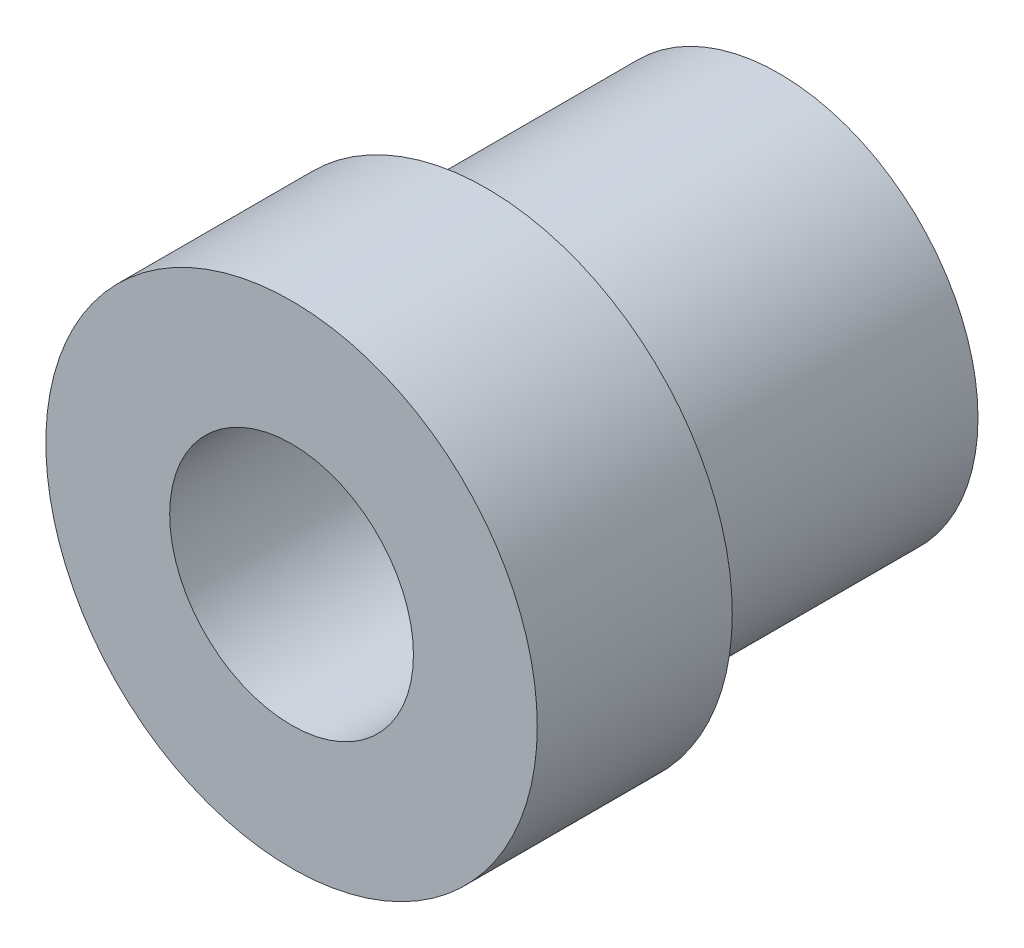
ISO-10303-21;
HEADER;
FILE_DESCRIPTION(('STEP AP214'),'2;1');
FILE_NAME('part.step','',(''),(''),'','','');
FILE_SCHEMA(('AUTOMOTIVE_DESIGN { 1 0 10303 214 1 1 1 1 }'));
ENDSEC;
DATA;
#1=APPLICATION_CONTEXT('core data for automotive mechanical design processes');
#2=APPLICATION_PROTOCOL_DEFINITION('international standard','automotive_design',2000,#1);
#3=PRODUCT_CONTEXT('',#1,'mechanical');
#4=PRODUCT('Part','Part','',(#3));
#5=PRODUCT_RELATED_PRODUCT_CATEGORY('part','',(#4));
#6=PRODUCT_DEFINITION_FORMATION('','',#4);
#7=PRODUCT_DEFINITION_CONTEXT('part definition',#1,'design');
#8=PRODUCT_DEFINITION('design','',#6,#7);
#9=PRODUCT_DEFINITION_SHAPE('','',#8);
#10=(LENGTH_UNIT() NAMED_UNIT(*) SI_UNIT(.MILLI.,.METRE.));
#11=(NAMED_UNIT(*) PLANE_ANGLE_UNIT() SI_UNIT($,.RADIAN.));
#12=(NAMED_UNIT(*) SI_UNIT($,.STERADIAN.) SOLID_ANGLE_UNIT());
#13=UNCERTAINTY_MEASURE_WITH_UNIT(LENGTH_MEASURE(1.E-05),#10,'distance_accuracy_value','');
#14=(GEOMETRIC_REPRESENTATION_CONTEXT(3) GLOBAL_UNCERTAINTY_ASSIGNED_CONTEXT((#13)) GLOBAL_UNIT_ASSIGNED_CONTEXT((#10,
#11,#12)) REPRESENTATION_CONTEXT('',''));
#15=CARTESIAN_POINT('',(0.,0.,0.));
#16=DIRECTION('',(0.,0.,1.));
#17=DIRECTION('',(1.,0.,0.));
#18=AXIS2_PLACEMENT_3D('',#15,#16,#17);
#19=CARTESIAN_POINT('',(0.,0.,6.35));
#20=DIRECTION('',(0.,0.,-1.));
#21=DIRECTION('',(-1.,0.,0.));
#22=AXIS2_PLACEMENT_3D('',#19,#20,#21);
#23=CYLINDRICAL_SURFACE('',#22,8.001);
#24=CARTESIAN_POINT('',(0.,0.,6.35));
#25=DIRECTION('',(0.,0.,1.));
#26=DIRECTION('',(1.,0.,0.));
#27=AXIS2_PLACEMENT_3D('',#24,#25,#26);
#28=CIRCLE('',#27,8.001);
#29=CARTESIAN_POINT('',(8.001,0.,6.35));
#30=VERTEX_POINT('',#29);
#31=EDGE_CURVE('E53',#30,#30,#28,.T.);
#32=ORIENTED_EDGE('',*,*,#31,.F.);
#33=EDGE_LOOP('',(#32));
#34=FACE_BOUND('',#33,.T.);
#35=CARTESIAN_POINT('',(0.,0.,0.));
#36=DIRECTION('',(0.,0.,1.));
#37=DIRECTION('',(1.,0.,0.));
#38=AXIS2_PLACEMENT_3D('',#35,#36,#37);
#39=CIRCLE('',#38,8.001);
#40=CARTESIAN_POINT('',(8.001,0.,0.));
#41=VERTEX_POINT('',#40);
#42=EDGE_CURVE('E48',#41,#41,#39,.T.);
#43=ORIENTED_EDGE('',*,*,#42,.T.);
#44=EDGE_LOOP('',(#43));
#45=FACE_BOUND('',#44,.T.);
#46=ADVANCED_FACE('F45',(#34,#45),#23,.T.);
#47=CARTESIAN_POINT('',(0.,0.,6.35));
#48=DIRECTION('',(0.,0.,-1.));
#49=DIRECTION('',(-1.,0.,0.));
#50=AXIS2_PLACEMENT_3D('',#47,#48,#49);
#51=CYLINDRICAL_SURFACE('',#50,3.96875);
#52=CARTESIAN_POINT('',(0.,0.,6.35));
#53=DIRECTION('',(0.,0.,1.));
#54=DIRECTION('',(1.,0.,0.));
#55=AXIS2_PLACEMENT_3D('',#52,#53,#54);
#56=CIRCLE('',#55,3.96875);
#57=CARTESIAN_POINT('',(3.96875,0.,6.35));
#58=VERTEX_POINT('',#57);
#59=EDGE_CURVE('E10',#58,#58,#56,.T.);
#60=ORIENTED_EDGE('',*,*,#59,.T.);
#61=EDGE_LOOP('',(#60));
#62=FACE_BOUND('',#61,.T.);
#63=CARTESIAN_POINT('',(0.,0.,-9.525));
#64=DIRECTION('',(0.,0.,1.));
#65=DIRECTION('',(1.,0.,0.));
#66=AXIS2_PLACEMENT_3D('',#63,#64,#65);
#67=CIRCLE('',#66,3.96875);
#68=CARTESIAN_POINT('',(3.96875,0.,-9.525));
#69=VERTEX_POINT('',#68);
#70=EDGE_CURVE('E64',#69,#69,#67,.T.);
#71=ORIENTED_EDGE('',*,*,#70,.F.);
#72=EDGE_LOOP('',(#71));
#73=FACE_BOUND('',#72,.T.);
#74=ADVANCED_FACE('F76',(#62,#73),#51,.F.);
#75=CARTESIAN_POINT('',(0.,0.,6.35));
#76=DIRECTION('',(0.,0.,1.));
#77=DIRECTION('',(1.,0.,0.));
#78=AXIS2_PLACEMENT_3D('',#75,#76,#77);
#79=PLANE('',#78);
#80=ORIENTED_EDGE('',*,*,#31,.T.);
#81=EDGE_LOOP('',(#80));
#82=FACE_BOUND('',#81,.T.);
#83=ORIENTED_EDGE('',*,*,#59,.F.);
#84=EDGE_LOOP('',(#83));
#85=FACE_BOUND('',#84,.T.);
#86=ADVANCED_FACE('F78',(#82,#85),#79,.T.);
#87=CARTESIAN_POINT('',(0.,0.,0.));
#88=DIRECTION('',(0.,0.,1.));
#89=DIRECTION('',(1.,0.,0.));
#90=AXIS2_PLACEMENT_3D('',#87,#88,#89);
#91=PLANE('',#90);
#92=CARTESIAN_POINT('',(0.,0.,0.));
#93=DIRECTION('',(0.,0.,1.));
#94=DIRECTION('',(1.,0.,0.));
#95=AXIS2_PLACEMENT_3D('',#92,#93,#94);
#96=CIRCLE('',#95,6.477);
#97=CARTESIAN_POINT('',(6.477,0.,0.));
#98=VERTEX_POINT('',#97);
#99=EDGE_CURVE('E60',#98,#98,#96,.T.);
#100=ORIENTED_EDGE('',*,*,#99,.T.);
#101=EDGE_LOOP('',(#100));
#102=FACE_BOUND('',#101,.T.);
#103=ORIENTED_EDGE('',*,*,#42,.F.);
#104=EDGE_LOOP('',(#103));
#105=FACE_BOUND('',#104,.T.);
#106=ADVANCED_FACE('F83',(#102,#105),#91,.F.);
#107=CARTESIAN_POINT('',(0.,0.,-9.525));
#108=DIRECTION('',(0.,0.,1.));
#109=DIRECTION('',(1.,0.,0.));
#110=AXIS2_PLACEMENT_3D('',#107,#108,#109);
#111=CYLINDRICAL_SURFACE('',#110,6.477);
#112=CARTESIAN_POINT('',(0.,0.,-9.525));
#113=DIRECTION('',(0.,0.,1.));
#114=DIRECTION('',(1.,0.,0.));
#115=AXIS2_PLACEMENT_3D('',#112,#113,#114);
#116=CIRCLE('',#115,6.477);
#117=CARTESIAN_POINT('',(6.477,0.,-9.525));
#118=VERTEX_POINT('',#117);
#119=EDGE_CURVE('E65',#118,#118,#116,.T.);
#120=CARTESIAN_POINT('',(6.477,0.,-9.525));
#121=CARTESIAN_POINT('',(6.477,0.,-9.42578125));
#122=CARTESIAN_POINT('',(6.477,0.,-9.3265625));
#123=CARTESIAN_POINT('',(6.477,0.,-9.128125));
#124=CARTESIAN_POINT('',(6.477,0.,-9.02890625));
#125=CARTESIAN_POINT('',(6.477,0.,-8.83046875));
#126=CARTESIAN_POINT('',(6.477,0.,-8.73125));
#127=CARTESIAN_POINT('',(6.477,0.,-8.5328125));
#128=CARTESIAN_POINT('',(6.477,0.,-8.43359375));
#129=CARTESIAN_POINT('',(6.477,0.,-8.23515625));
#130=CARTESIAN_POINT('',(6.477,0.,-8.1359375));
#131=CARTESIAN_POINT('',(6.477,0.,-7.9375));
#132=CARTESIAN_POINT('',(6.477,0.,-7.83828125));
#133=CARTESIAN_POINT('',(6.477,0.,-7.63984375));
#134=CARTESIAN_POINT('',(6.477,0.,-7.540625));
#135=CARTESIAN_POINT('',(6.477,0.,-7.3421875));
#136=CARTESIAN_POINT('',(6.477,0.,-7.24296875));
#137=CARTESIAN_POINT('',(6.477,0.,-7.04453125));
#138=CARTESIAN_POINT('',(6.477,0.,-6.9453125));
#139=CARTESIAN_POINT('',(6.477,0.,-6.746875));
#140=CARTESIAN_POINT('',(6.477,0.,-6.64765625));
#141=CARTESIAN_POINT('',(6.477,0.,-6.44921875));
#142=CARTESIAN_POINT('',(6.477,0.,-6.35));
#143=CARTESIAN_POINT('',(6.477,0.,-6.1515625));
#144=CARTESIAN_POINT('',(6.477,0.,-6.05234375));
#145=CARTESIAN_POINT('',(6.477,0.,-5.85390625));
#146=CARTESIAN_POINT('',(6.477,0.,-5.7546875));
#147=CARTESIAN_POINT('',(6.477,0.,-5.55625));
#148=CARTESIAN_POINT('',(6.477,0.,-5.45703125));
#149=CARTESIAN_POINT('',(6.477,0.,-5.25859375));
#150=CARTESIAN_POINT('',(6.477,0.,-5.159375));
#151=CARTESIAN_POINT('',(6.477,0.,-4.9609375));
#152=CARTESIAN_POINT('',(6.477,0.,-4.86171875));
#153=CARTESIAN_POINT('',(6.477,0.,-4.66328125));
#154=CARTESIAN_POINT('',(6.477,0.,-4.5640625));
#155=CARTESIAN_POINT('',(6.477,0.,-4.365625));
#156=CARTESIAN_POINT('',(6.477,0.,-4.26640625));
#157=CARTESIAN_POINT('',(6.477,0.,-4.06796875));
#158=CARTESIAN_POINT('',(6.477,0.,-3.96875));
#159=CARTESIAN_POINT('',(6.477,0.,-3.7703125));
#160=CARTESIAN_POINT('',(6.477,0.,-3.67109375));
#161=CARTESIAN_POINT('',(6.477,0.,-3.47265625));
#162=CARTESIAN_POINT('',(6.477,0.,-3.3734375));
#163=CARTESIAN_POINT('',(6.477,0.,-3.175));
#164=CARTESIAN_POINT('',(6.477,0.,-3.07578125));
#165=CARTESIAN_POINT('',(6.477,0.,-2.87734375));
#166=CARTESIAN_POINT('',(6.477,0.,-2.778125));
#167=CARTESIAN_POINT('',(6.477,0.,-2.5796875));
#168=CARTESIAN_POINT('',(6.477,0.,-2.48046875));
#169=CARTESIAN_POINT('',(6.477,0.,-2.28203125));
#170=CARTESIAN_POINT('',(6.477,0.,-2.1828125));
#171=CARTESIAN_POINT('',(6.477,0.,-1.984375));
#172=CARTESIAN_POINT('',(6.477,0.,-1.88515625));
#173=CARTESIAN_POINT('',(6.477,0.,-1.68671875));
#174=CARTESIAN_POINT('',(6.477,0.,-1.5875));
#175=CARTESIAN_POINT('',(6.477,0.,-1.3890625));
#176=CARTESIAN_POINT('',(6.477,0.,-1.28984375));
#177=CARTESIAN_POINT('',(6.477,0.,-1.09140625));
#178=CARTESIAN_POINT('',(6.477,0.,-0.992187500000001));
#179=CARTESIAN_POINT('',(6.477,0.,-0.793750000000001));
#180=CARTESIAN_POINT('',(6.477,0.,-0.69453125));
#181=CARTESIAN_POINT('',(6.477,0.,-0.49609375));
#182=CARTESIAN_POINT('',(6.477,0.,-0.396875));
#183=CARTESIAN_POINT('',(6.477,0.,-0.1984375));
#184=CARTESIAN_POINT('',(6.477,0.,-0.0992187500000001));
#185=CARTESIAN_POINT('',(6.477,0.,0.));
#186=B_SPLINE_CURVE_WITH_KNOTS('',3,(#120,#121,#122,#123,#124,#125,#126,#127,#128,#129,#130,
#131,#132,#133,#134,#135,#136,#137,#138,#139,#140,#141,#142,#143,#144,#145,#146,#147,#148,#149,
#150,#151,#152,#153,#154,#155,#156,#157,#158,#159,#160,#161,#162,#163,#164,#165,#166,#167,#168,
#169,#170,#171,#172,#173,#174,#175,#176,#177,#178,#179,#180,#181,#182,#183,#184,#185),
.UNSPECIFIED.,.F.,.F.,(4,2,2,2,2,2,2,2,2,2,2,2,2,2,2,2,2,2,2,2,2,2,2,2,2,2,2,2,2,2,2,2,4),(0.,
0.297656249999998,0.595312499999999,0.892968749999999,1.190625,1.48828125,1.7859375,2.08359375,
2.38125,2.67890625,2.9765625,3.27421875,3.571875,3.86953125,4.1671875,4.46484375,4.7625,
5.06015625,5.3578125,5.65546875,5.953125,6.25078125,6.5484375,6.84609375,7.14375,7.44140625,
7.7390625,8.03671875,8.334375,8.63203125,8.9296875,9.22734375,9.525),.UNSPECIFIED.);
#187=EDGE_CURVE('BSEAM89',#118,#98,#186,.T.);
#188=ORIENTED_EDGE('',*,*,#119,.T.);
#189=ORIENTED_EDGE('',*,*,#99,.F.);
#190=ORIENTED_EDGE('',*,*,#187,.T.);
#191=ORIENTED_EDGE('',*,*,#187,.F.);
#192=EDGE_LOOP('',(#188,#190,#189,#191));
#193=FACE_BOUND('',#192,.T.);
#194=ADVANCED_FACE('F89',(#193),#111,.T.);
#195=CARTESIAN_POINT('',(0.,0.,-9.525));
#196=DIRECTION('',(0.,0.,1.));
#197=DIRECTION('',(1.,0.,0.));
#198=AXIS2_PLACEMENT_3D('',#195,#196,#197);
#199=PLANE('',#198);
#200=ORIENTED_EDGE('',*,*,#70,.T.);
#201=EDGE_LOOP('',(#200));
#202=FACE_BOUND('',#201,.T.);
#203=ORIENTED_EDGE('',*,*,#119,.F.);
#204=EDGE_LOOP('',(#203));
#205=FACE_BOUND('',#204,.T.);
#206=ADVANCED_FACE('F73',(#202,#205),#199,.F.);
#207=CLOSED_SHELL('',(#46,#74,#86,#106,#194,#206));
#208=MANIFOLD_SOLID_BREP('B2',#207);
#209=ADVANCED_BREP_SHAPE_REPRESENTATION('',(#18,#208),#14);
#210=SHAPE_DEFINITION_REPRESENTATION(#9,#209);
ENDSEC;
END-ISO-10303-21;
